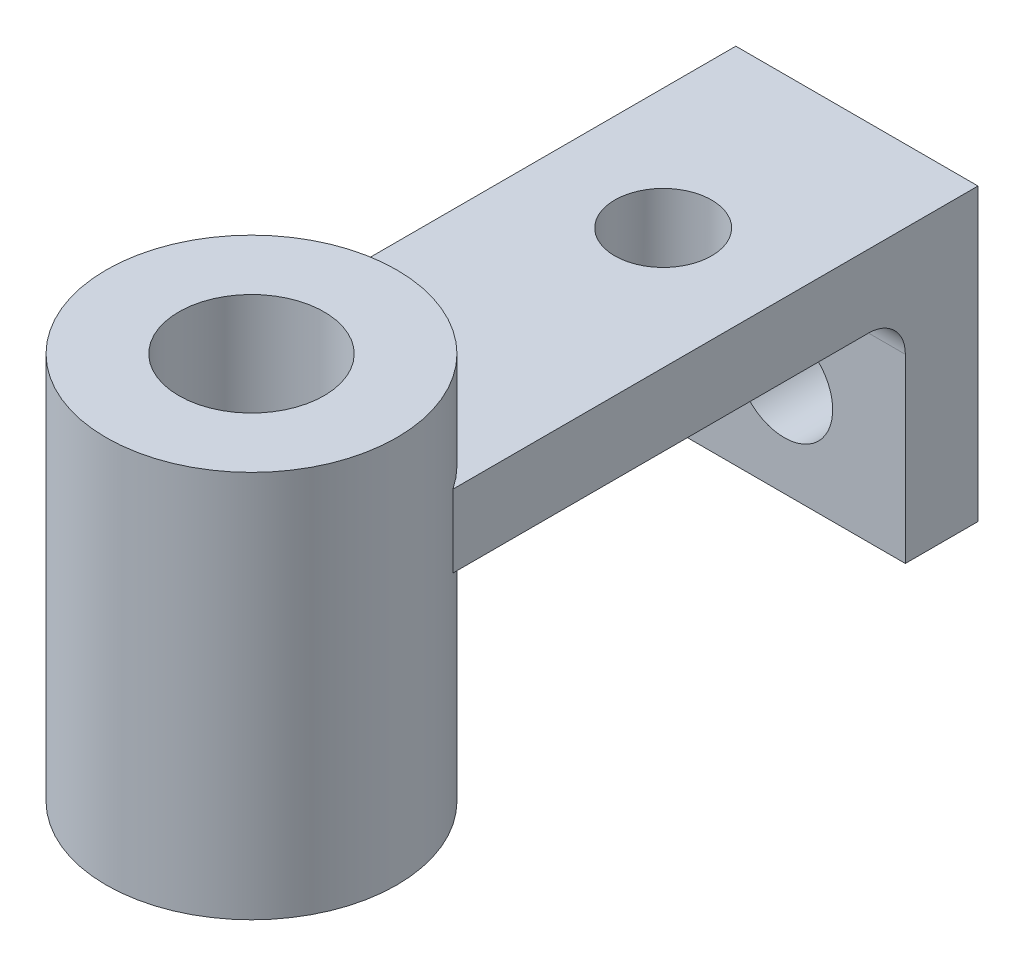
ISO-10303-21;
HEADER;
FILE_DESCRIPTION(('STEP AP214'),'2;1');
FILE_NAME('part.step','',(''),(''),'','','');
FILE_SCHEMA(('AUTOMOTIVE_DESIGN { 1 0 10303 214 1 1 1 1 }'));
ENDSEC;
DATA;
#1=APPLICATION_CONTEXT('core data for automotive mechanical design processes');
#2=APPLICATION_PROTOCOL_DEFINITION('international standard','automotive_design',2000,#1);
#3=PRODUCT_CONTEXT('',#1,'mechanical');
#4=PRODUCT('Part','Part','',(#3));
#5=PRODUCT_RELATED_PRODUCT_CATEGORY('part','',(#4));
#6=PRODUCT_DEFINITION_FORMATION('','',#4);
#7=PRODUCT_DEFINITION_CONTEXT('part definition',#1,'design');
#8=PRODUCT_DEFINITION('design','',#6,#7);
#9=PRODUCT_DEFINITION_SHAPE('','',#8);
#10=(LENGTH_UNIT() NAMED_UNIT(*) SI_UNIT(.MILLI.,.METRE.));
#11=(NAMED_UNIT(*) PLANE_ANGLE_UNIT() SI_UNIT($,.RADIAN.));
#12=(NAMED_UNIT(*) SI_UNIT($,.STERADIAN.) SOLID_ANGLE_UNIT());
#13=UNCERTAINTY_MEASURE_WITH_UNIT(LENGTH_MEASURE(1.E-05),#10,'distance_accuracy_value','');
#14=(GEOMETRIC_REPRESENTATION_CONTEXT(3) GLOBAL_UNCERTAINTY_ASSIGNED_CONTEXT((#13)) GLOBAL_UNIT_ASSIGNED_CONTEXT((#10,
#11,#12)) REPRESENTATION_CONTEXT('',''));
#15=CARTESIAN_POINT('',(0.,0.,0.));
#16=DIRECTION('',(0.,0.,1.));
#17=DIRECTION('',(1.,0.,0.));
#18=AXIS2_PLACEMENT_3D('',#15,#16,#17);
#19=CARTESIAN_POINT('',(31.75,-9.58849999999999,-25.3365));
#20=DIRECTION('',(-1.,0.,0.));
#21=DIRECTION('',(0.,0.,1.));
#22=AXIS2_PLACEMENT_3D('',#19,#20,#21);
#23=CYLINDRICAL_SURFACE('',#22,4.826);
#24=CARTESIAN_POINT('',(0.,-9.58849999999999,-25.3365));
#25=DIRECTION('',(1.,0.,0.));
#26=DIRECTION('',(0.,0.,-1.));
#27=AXIS2_PLACEMENT_3D('',#24,#25,#26);
#28=CIRCLE('',#27,4.826);
#29=CARTESIAN_POINT('',(0.,-9.58850000000002,-30.1625));
#30=VERTEX_POINT('',#29);
#31=CARTESIAN_POINT('',(0.,-4.76249999999999,-25.3365));
#32=VERTEX_POINT('',#31);
#33=EDGE_CURVE('E138',#30,#32,#28,.T.);
#34=ORIENTED_EDGE('',*,*,#33,.F.);
#35=DIRECTION('',(-1.,0.,0.));
#36=VECTOR('',#35,1.);
#37=CARTESIAN_POINT('',(31.75,-9.58850000000002,-30.1625));
#38=LINE('',#37,#36);
#39=CARTESIAN_POINT('',(31.75,-9.58850000000002,-30.1625));
#40=VERTEX_POINT('',#39);
#41=EDGE_CURVE('E47',#40,#30,#38,.T.);
#42=ORIENTED_EDGE('',*,*,#41,.F.);
#43=CARTESIAN_POINT('',(31.75,-9.58849999999999,-25.3365));
#44=DIRECTION('',(1.,0.,0.));
#45=DIRECTION('',(0.,0.,-1.));
#46=AXIS2_PLACEMENT_3D('',#43,#44,#45);
#47=CIRCLE('',#46,4.826);
#48=CARTESIAN_POINT('',(31.75,-4.76249999999999,-25.3365));
#49=VERTEX_POINT('',#48);
#50=EDGE_CURVE('E159',#40,#49,#47,.T.);
#51=ORIENTED_EDGE('',*,*,#50,.T.);
#52=DIRECTION('',(-1.,0.,0.));
#53=VECTOR('',#52,1.);
#54=CARTESIAN_POINT('',(31.75,-4.76249999999999,-25.3365));
#55=LINE('',#54,#53);
#56=EDGE_CURVE('E91',#49,#32,#55,.T.);
#57=ORIENTED_EDGE('',*,*,#56,.T.);
#58=EDGE_LOOP('',(#34,#42,#51,#57));
#59=FACE_BOUND('',#58,.T.);
#60=ADVANCED_FACE('F39',(#59),#23,.F.);
#61=CARTESIAN_POINT('',(31.75,-33.3375,-30.1625));
#62=DIRECTION('',(0.,0.,1.));
#63=DIRECTION('',(1.,0.,0.));
#64=AXIS2_PLACEMENT_3D('',#61,#62,#63);
#65=PLANE('',#64);
#66=CARTESIAN_POINT('',(15.875,-20.6375,-30.1625));
#67=DIRECTION('',(0.,0.,1.));
#68=DIRECTION('',(1.,0.,0.));
#69=AXIS2_PLACEMENT_3D('',#66,#67,#68);
#70=CIRCLE('',#69,6.35);
#71=CARTESIAN_POINT('',(9.525,-20.6375,-30.1625));
#72=VERTEX_POINT('',#71);
#73=EDGE_CURVE('E257',#72,#72,#70,.F.);
#74=ORIENTED_EDGE('',*,*,#73,.T.);
#75=EDGE_LOOP('',(#74));
#76=FACE_BOUND('',#75,.T.);
#77=DIRECTION('',(0.,1.,0.));
#78=VECTOR('',#77,1.);
#79=CARTESIAN_POINT('',(0.,-33.3375,-30.1625));
#80=LINE('',#79,#78);
#81=CARTESIAN_POINT('',(0.,-33.3375,-30.1625));
#82=VERTEX_POINT('',#81);
#83=EDGE_CURVE('E155',#82,#30,#80,.T.);
#84=ORIENTED_EDGE('',*,*,#83,.F.);
#85=DIRECTION('',(-1.,0.,0.));
#86=VECTOR('',#85,1.);
#87=CARTESIAN_POINT('',(31.75,-33.3375,-30.1625));
#88=LINE('',#87,#86);
#89=CARTESIAN_POINT('',(31.75,-33.3375,-30.1625));
#90=VERTEX_POINT('',#89);
#91=EDGE_CURVE('E113',#90,#82,#88,.T.);
#92=ORIENTED_EDGE('',*,*,#91,.F.);
#93=DIRECTION('',(0.,1.,0.));
#94=VECTOR('',#93,1.);
#95=CARTESIAN_POINT('',(31.75,-33.3375,-30.1625));
#96=LINE('',#95,#94);
#97=EDGE_CURVE('E122',#90,#40,#96,.T.);
#98=ORIENTED_EDGE('',*,*,#97,.T.);
#99=ORIENTED_EDGE('',*,*,#41,.T.);
#100=EDGE_LOOP('',(#84,#92,#98,#99));
#101=FACE_BOUND('',#100,.T.);
#102=ADVANCED_FACE('F174',(#76,#101),#65,.T.);
#103=CARTESIAN_POINT('',(31.75,-33.3375,-39.6875));
#104=DIRECTION('',(0.,-1.,0.));
#105=DIRECTION('',(0.,0.,-1.));
#106=AXIS2_PLACEMENT_3D('',#103,#104,#105);
#107=PLANE('',#106);
#108=DIRECTION('',(0.,0.,1.));
#109=VECTOR('',#108,1.);
#110=CARTESIAN_POINT('',(0.,-33.3375,-39.6875));
#111=LINE('',#110,#109);
#112=CARTESIAN_POINT('',(0.,-33.3375,-39.6875));
#113=VERTEX_POINT('',#112);
#114=EDGE_CURVE('E107',#113,#82,#111,.T.);
#115=ORIENTED_EDGE('',*,*,#114,.F.);
#116=DIRECTION('',(-1.,0.,0.));
#117=VECTOR('',#116,1.);
#118=CARTESIAN_POINT('',(31.75,-33.3375,-39.6875));
#119=LINE('',#118,#117);
#120=CARTESIAN_POINT('',(31.75,-33.3375,-39.6875));
#121=VERTEX_POINT('',#120);
#122=EDGE_CURVE('E101',#121,#113,#119,.T.);
#123=ORIENTED_EDGE('',*,*,#122,.F.);
#124=DIRECTION('',(0.,0.,1.));
#125=VECTOR('',#124,1.);
#126=CARTESIAN_POINT('',(31.75,-33.3375,-39.6875));
#127=LINE('',#126,#125);
#128=EDGE_CURVE('E104',#121,#90,#127,.T.);
#129=ORIENTED_EDGE('',*,*,#128,.T.);
#130=ORIENTED_EDGE('',*,*,#91,.T.);
#131=EDGE_LOOP('',(#115,#123,#129,#130));
#132=FACE_BOUND('',#131,.T.);
#133=ADVANCED_FACE('F103',(#132),#107,.T.);
#134=CARTESIAN_POINT('',(31.75,4.7625,-39.6875));
#135=DIRECTION('',(0.,0.,-1.));
#136=DIRECTION('',(-1.,0.,0.));
#137=AXIS2_PLACEMENT_3D('',#134,#135,#136);
#138=PLANE('',#137);
#139=CARTESIAN_POINT('',(15.875,-20.6375,-39.6875));
#140=DIRECTION('',(0.,0.,-1.));
#141=DIRECTION('',(-1.,0.,0.));
#142=AXIS2_PLACEMENT_3D('',#139,#140,#141);
#143=CIRCLE('',#142,6.35);
#144=CARTESIAN_POINT('',(9.525,-20.6375,-39.6875));
#145=VERTEX_POINT('',#144);
#146=EDGE_CURVE('E143',#145,#145,#143,.T.);
#147=ORIENTED_EDGE('',*,*,#146,.F.);
#148=EDGE_LOOP('',(#147));
#149=FACE_BOUND('',#148,.T.);
#150=DIRECTION('',(0.,-1.,0.));
#151=VECTOR('',#150,1.);
#152=CARTESIAN_POINT('',(0.,4.7625,-39.6875));
#153=LINE('',#152,#151);
#154=CARTESIAN_POINT('',(0.,4.7625,-39.6875));
#155=VERTEX_POINT('',#154);
#156=EDGE_CURVE('E150',#155,#113,#153,.T.);
#157=ORIENTED_EDGE('',*,*,#156,.F.);
#158=DIRECTION('',(-1.,0.,0.));
#159=VECTOR('',#158,1.);
#160=CARTESIAN_POINT('',(31.75,4.7625,-39.6875));
#161=LINE('',#160,#159);
#162=CARTESIAN_POINT('',(31.75,4.7625,-39.6875));
#163=VERTEX_POINT('',#162);
#164=EDGE_CURVE('E114',#163,#155,#161,.T.);
#165=ORIENTED_EDGE('',*,*,#164,.F.);
#166=DIRECTION('',(0.,-1.,0.));
#167=VECTOR('',#166,1.);
#168=CARTESIAN_POINT('',(31.75,4.7625,-39.6875));
#169=LINE('',#168,#167);
#170=EDGE_CURVE('E121',#163,#121,#169,.T.);
#171=ORIENTED_EDGE('',*,*,#170,.T.);
#172=ORIENTED_EDGE('',*,*,#122,.T.);
#173=EDGE_LOOP('',(#157,#165,#171,#172));
#174=FACE_BOUND('',#173,.T.);
#175=ADVANCED_FACE('F126',(#149,#174),#138,.T.);
#176=CARTESIAN_POINT('',(31.75,4.7625,39.6875));
#177=DIRECTION('',(0.,1.,0.));
#178=DIRECTION('',(0.,0.,1.));
#179=AXIS2_PLACEMENT_3D('',#176,#177,#178);
#180=PLANE('',#179);
#181=CARTESIAN_POINT('',(15.875,4.7625,39.6875));
#182=DIRECTION('',(0.,1.,0.));
#183=DIRECTION('',(0.,0.,1.));
#184=AXIS2_PLACEMENT_3D('',#181,#182,#183);
#185=CIRCLE('',#184,19.05);
#186=CARTESIAN_POINT('',(31.75,4.7625,29.1572162906216));
#187=VERTEX_POINT('',#186);
#188=CARTESIAN_POINT('',(0.,4.7625,29.1572162906216));
#189=VERTEX_POINT('',#188);
#190=EDGE_CURVE('E54',#187,#189,#185,.T.);
#191=ORIENTED_EDGE('',*,*,#190,.F.);
#192=DIRECTION('',(0.,0.,-1.));
#193=VECTOR('',#192,1.);
#194=CARTESIAN_POINT('',(31.75,4.7625,39.6875));
#195=LINE('',#194,#193);
#196=EDGE_CURVE('E129',#187,#163,#195,.T.);
#197=ORIENTED_EDGE('',*,*,#196,.T.);
#198=ORIENTED_EDGE('',*,*,#164,.T.);
#199=DIRECTION('',(0.,0.,-1.));
#200=VECTOR('',#199,1.);
#201=CARTESIAN_POINT('',(0.,4.7625,39.6875));
#202=LINE('',#201,#200);
#203=EDGE_CURVE('E147',#189,#155,#202,.T.);
#204=ORIENTED_EDGE('',*,*,#203,.F.);
#205=EDGE_LOOP('',(#191,#197,#198,#204));
#206=FACE_BOUND('',#205,.T.);
#207=CARTESIAN_POINT('',(15.875,4.7625,-14.2875));
#208=DIRECTION('',(0.,1.,0.));
#209=DIRECTION('',(0.,0.,1.));
#210=AXIS2_PLACEMENT_3D('',#207,#208,#209);
#211=CIRCLE('',#210,6.35);
#212=CARTESIAN_POINT('',(15.875,4.7625,-7.9375));
#213=VERTEX_POINT('',#212);
#214=EDGE_CURVE('E253',#213,#213,#211,.T.);
#215=ORIENTED_EDGE('',*,*,#214,.F.);
#216=EDGE_LOOP('',(#215));
#217=FACE_BOUND('',#216,.T.);
#218=ADVANCED_FACE('F189',(#206,#217),#180,.T.);
#219=CARTESIAN_POINT('',(31.75,-4.76249999999999,-25.3365));
#220=DIRECTION('',(0.,-1.,0.));
#221=DIRECTION('',(0.,0.,-1.));
#222=AXIS2_PLACEMENT_3D('',#219,#220,#221);
#223=PLANE('',#222);
#224=CARTESIAN_POINT('',(15.875,-4.7625,39.6875));
#225=DIRECTION('',(0.,-1.,0.));
#226=DIRECTION('',(0.,0.,-1.));
#227=AXIS2_PLACEMENT_3D('',#224,#225,#226);
#228=CIRCLE('',#227,19.05);
#229=CARTESIAN_POINT('',(0.,-4.7625,29.1572162906216));
#230=VERTEX_POINT('',#229);
#231=CARTESIAN_POINT('',(31.75,-4.7625,29.1572162906216));
#232=VERTEX_POINT('',#231);
#233=EDGE_CURVE('E171',#230,#232,#228,.T.);
#234=ORIENTED_EDGE('',*,*,#233,.F.);
#235=DIRECTION('',(0.,0.,1.));
#236=VECTOR('',#235,1.);
#237=CARTESIAN_POINT('',(0.,-4.76249999999999,-25.3365));
#238=LINE('',#237,#236);
#239=EDGE_CURVE('E142',#32,#230,#238,.T.);
#240=ORIENTED_EDGE('',*,*,#239,.F.);
#241=ORIENTED_EDGE('',*,*,#56,.F.);
#242=DIRECTION('',(0.,0.,1.));
#243=VECTOR('',#242,1.);
#244=CARTESIAN_POINT('',(31.75,-4.76249999999999,-25.3365));
#245=LINE('',#244,#243);
#246=EDGE_CURVE('E132',#49,#232,#245,.T.);
#247=ORIENTED_EDGE('',*,*,#246,.T.);
#248=EDGE_LOOP('',(#234,#240,#241,#247));
#249=FACE_BOUND('',#248,.T.);
#250=CARTESIAN_POINT('',(15.875,-4.76249999999999,-14.2875));
#251=DIRECTION('',(0.,-1.,0.));
#252=DIRECTION('',(0.,0.,-1.));
#253=AXIS2_PLACEMENT_3D('',#250,#251,#252);
#254=CIRCLE('',#253,6.35);
#255=CARTESIAN_POINT('',(15.875,-4.76249999999999,-20.6375));
#256=VERTEX_POINT('',#255);
#257=EDGE_CURVE('E252',#256,#256,#254,.F.);
#258=ORIENTED_EDGE('',*,*,#257,.T.);
#259=EDGE_LOOP('',(#258));
#260=FACE_BOUND('',#259,.T.);
#261=ADVANCED_FACE('F167',(#249,#260),#223,.T.);
#262=CARTESIAN_POINT('',(31.75,-9.58849999999999,-25.3365));
#263=DIRECTION('',(1.,0.,0.));
#264=DIRECTION('',(0.,0.,-1.));
#265=AXIS2_PLACEMENT_3D('',#262,#263,#264);
#266=PLANE('',#265);
#267=DIRECTION('',(0.,1.,0.));
#268=VECTOR('',#267,1.);
#269=CARTESIAN_POINT('',(31.75,-33.3375,29.1572162906216));
#270=LINE('',#269,#268);
#271=EDGE_CURVE('E249',#232,#187,#270,.T.);
#272=ORIENTED_EDGE('',*,*,#271,.F.);
#273=ORIENTED_EDGE('',*,*,#246,.F.);
#274=ORIENTED_EDGE('',*,*,#50,.F.);
#275=ORIENTED_EDGE('',*,*,#97,.F.);
#276=ORIENTED_EDGE('',*,*,#128,.F.);
#277=ORIENTED_EDGE('',*,*,#170,.F.);
#278=ORIENTED_EDGE('',*,*,#196,.F.);
#279=EDGE_LOOP('',(#272,#273,#274,#275,#276,#277,#278));
#280=FACE_BOUND('',#279,.T.);
#281=ADVANCED_FACE('F119',(#280),#266,.T.);
#282=CARTESIAN_POINT('',(0.,-9.58849999999999,-25.3365));
#283=DIRECTION('',(1.,0.,0.));
#284=DIRECTION('',(0.,0.,-1.));
#285=AXIS2_PLACEMENT_3D('',#282,#283,#284);
#286=PLANE('',#285);
#287=ORIENTED_EDGE('',*,*,#239,.T.);
#288=DIRECTION('',(0.,1.,0.));
#289=VECTOR('',#288,1.);
#290=CARTESIAN_POINT('',(0.,-33.3375,29.1572162906216));
#291=LINE('',#290,#289);
#292=EDGE_CURVE('E11',#230,#189,#291,.T.);
#293=ORIENTED_EDGE('',*,*,#292,.T.);
#294=ORIENTED_EDGE('',*,*,#203,.T.);
#295=ORIENTED_EDGE('',*,*,#156,.T.);
#296=ORIENTED_EDGE('',*,*,#114,.T.);
#297=ORIENTED_EDGE('',*,*,#83,.T.);
#298=ORIENTED_EDGE('',*,*,#33,.T.);
#299=EDGE_LOOP('',(#287,#293,#294,#295,#296,#297,#298));
#300=FACE_BOUND('',#299,.T.);
#301=ADVANCED_FACE('F173',(#300),#286,.F.);
#302=CARTESIAN_POINT('',(15.875,-20.6375,39.6885));
#303=DIRECTION('',(0.,0.,-1.));
#304=DIRECTION('',(-1.,0.,0.));
#305=AXIS2_PLACEMENT_3D('',#302,#303,#304);
#306=CYLINDRICAL_SURFACE('',#305,6.35);
#307=CARTESIAN_POINT('',(9.525,-20.6375,-30.1625));
#308=CARTESIAN_POINT('',(9.525,-20.6375,-30.26171875));
#309=CARTESIAN_POINT('',(9.525,-20.6375,-30.3609375));
#310=CARTESIAN_POINT('',(9.525,-20.6375,-30.559375));
#311=CARTESIAN_POINT('',(9.525,-20.6375,-30.65859375));
#312=CARTESIAN_POINT('',(9.525,-20.6375,-30.85703125));
#313=CARTESIAN_POINT('',(9.525,-20.6375,-30.95625));
#314=CARTESIAN_POINT('',(9.525,-20.6375,-31.1546875));
#315=CARTESIAN_POINT('',(9.525,-20.6375,-31.25390625));
#316=CARTESIAN_POINT('',(9.525,-20.6375,-31.45234375));
#317=CARTESIAN_POINT('',(9.525,-20.6375,-31.5515625));
#318=CARTESIAN_POINT('',(9.525,-20.6375,-31.75));
#319=CARTESIAN_POINT('',(9.525,-20.6375,-31.84921875));
#320=CARTESIAN_POINT('',(9.525,-20.6375,-32.04765625));
#321=CARTESIAN_POINT('',(9.525,-20.6375,-32.146875));
#322=CARTESIAN_POINT('',(9.525,-20.6375,-32.3453125));
#323=CARTESIAN_POINT('',(9.525,-20.6375,-32.44453125));
#324=CARTESIAN_POINT('',(9.525,-20.6375,-32.64296875));
#325=CARTESIAN_POINT('',(9.525,-20.6375,-32.7421875));
#326=CARTESIAN_POINT('',(9.525,-20.6375,-32.940625));
#327=CARTESIAN_POINT('',(9.525,-20.6375,-33.03984375));
#328=CARTESIAN_POINT('',(9.525,-20.6375,-33.23828125));
#329=CARTESIAN_POINT('',(9.525,-20.6375,-33.3375));
#330=CARTESIAN_POINT('',(9.525,-20.6375,-33.5359375));
#331=CARTESIAN_POINT('',(9.525,-20.6375,-33.63515625));
#332=CARTESIAN_POINT('',(9.525,-20.6375,-33.83359375));
#333=CARTESIAN_POINT('',(9.525,-20.6375,-33.9328125));
#334=CARTESIAN_POINT('',(9.525,-20.6375,-34.13125));
#335=CARTESIAN_POINT('',(9.525,-20.6375,-34.23046875));
#336=CARTESIAN_POINT('',(9.525,-20.6375,-34.42890625));
#337=CARTESIAN_POINT('',(9.525,-20.6375,-34.528125));
#338=CARTESIAN_POINT('',(9.525,-20.6375,-34.7265625));
#339=CARTESIAN_POINT('',(9.525,-20.6375,-34.82578125));
#340=CARTESIAN_POINT('',(9.525,-20.6375,-35.02421875));
#341=CARTESIAN_POINT('',(9.525,-20.6375,-35.1234375));
#342=CARTESIAN_POINT('',(9.525,-20.6375,-35.321875));
#343=CARTESIAN_POINT('',(9.525,-20.6375,-35.42109375));
#344=CARTESIAN_POINT('',(9.525,-20.6375,-35.61953125));
#345=CARTESIAN_POINT('',(9.525,-20.6375,-35.71875));
#346=CARTESIAN_POINT('',(9.525,-20.6375,-35.9171875));
#347=CARTESIAN_POINT('',(9.525,-20.6375,-36.01640625));
#348=CARTESIAN_POINT('',(9.525,-20.6375,-36.21484375));
#349=CARTESIAN_POINT('',(9.525,-20.6375,-36.3140625));
#350=CARTESIAN_POINT('',(9.525,-20.6375,-36.5125));
#351=CARTESIAN_POINT('',(9.525,-20.6375,-36.61171875));
#352=CARTESIAN_POINT('',(9.525,-20.6375,-36.81015625));
#353=CARTESIAN_POINT('',(9.525,-20.6375,-36.909375));
#354=CARTESIAN_POINT('',(9.525,-20.6375,-37.1078125));
#355=CARTESIAN_POINT('',(9.525,-20.6375,-37.20703125));
#356=CARTESIAN_POINT('',(9.525,-20.6375,-37.40546875));
#357=CARTESIAN_POINT('',(9.525,-20.6375,-37.5046875));
#358=CARTESIAN_POINT('',(9.525,-20.6375,-37.703125));
#359=CARTESIAN_POINT('',(9.525,-20.6375,-37.80234375));
#360=CARTESIAN_POINT('',(9.525,-20.6375,-38.00078125));
#361=CARTESIAN_POINT('',(9.525,-20.6375,-38.1));
#362=CARTESIAN_POINT('',(9.525,-20.6375,-38.2984375));
#363=CARTESIAN_POINT('',(9.525,-20.6375,-38.39765625));
#364=CARTESIAN_POINT('',(9.525,-20.6375,-38.59609375));
#365=CARTESIAN_POINT('',(9.525,-20.6375,-38.6953125));
#366=CARTESIAN_POINT('',(9.525,-20.6375,-38.89375));
#367=CARTESIAN_POINT('',(9.525,-20.6375,-38.99296875));
#368=CARTESIAN_POINT('',(9.525,-20.6375,-39.19140625));
#369=CARTESIAN_POINT('',(9.525,-20.6375,-39.290625));
#370=CARTESIAN_POINT('',(9.525,-20.6375,-39.4890625));
#371=CARTESIAN_POINT('',(9.525,-20.6375,-39.58828125));
#372=CARTESIAN_POINT('',(9.525,-20.6375,-39.6875));
#373=B_SPLINE_CURVE_WITH_KNOTS('',3,(#307,#308,#309,#310,#311,#312,#313,#314,#315,#316,#317,
#318,#319,#320,#321,#322,#323,#324,#325,#326,#327,#328,#329,#330,#331,#332,#333,#334,#335,#336,
#337,#338,#339,#340,#341,#342,#343,#344,#345,#346,#347,#348,#349,#350,#351,#352,#353,#354,#355,
#356,#357,#358,#359,#360,#361,#362,#363,#364,#365,#366,#367,#368,#369,#370,#371,#372),
.UNSPECIFIED.,.F.,.F.,(4,2,2,2,2,2,2,2,2,2,2,2,2,2,2,2,2,2,2,2,2,2,2,2,2,2,2,2,2,2,2,2,4),(0.,
0.29765625,0.5953125,0.892968750000001,1.190625,1.48828125,1.7859375,2.08359375,2.38125,
2.67890624999999,2.97656249999999,3.27421874999999,3.57187499999999,3.86953124999999,
4.16718749999999,4.46484374999999,4.76249999999999,5.06015624999999,5.35781249999999,
5.65546874999999,5.95312499999999,6.25078124999999,6.54843749999999,6.84609374999999,
7.14374999999998,7.44140624999998,7.73906249999998,8.03671874999998,8.33437499999998,
8.63203124999998,8.92968749999998,9.22734374999998,9.52499999999998),.UNSPECIFIED.);
#374=EDGE_CURVE('BSEAM200',#72,#145,#373,.T.);
#375=ORIENTED_EDGE('',*,*,#73,.F.);
#376=ORIENTED_EDGE('',*,*,#146,.T.);
#377=ORIENTED_EDGE('',*,*,#374,.T.);
#378=ORIENTED_EDGE('',*,*,#374,.F.);
#379=EDGE_LOOP('',(#375,#377,#376,#378));
#380=FACE_BOUND('',#379,.T.);
#381=ADVANCED_FACE('F200',(#380),#306,.F.);
#382=CARTESIAN_POINT('',(15.875,-33.3385,-14.2875));
#383=DIRECTION('',(0.,1.,0.));
#384=DIRECTION('',(0.,0.,1.));
#385=AXIS2_PLACEMENT_3D('',#382,#383,#384);
#386=CYLINDRICAL_SURFACE('',#385,6.35);
#387=ORIENTED_EDGE('',*,*,#257,.F.);
#388=EDGE_LOOP('',(#387));
#389=FACE_BOUND('',#388,.T.);
#390=ORIENTED_EDGE('',*,*,#214,.T.);
#391=EDGE_LOOP('',(#390));
#392=FACE_BOUND('',#391,.T.);
#393=ADVANCED_FACE('F204',(#389,#392),#386,.F.);
#394=CARTESIAN_POINT('',(15.875,-33.3375,39.6875));
#395=DIRECTION('',(0.,1.,0.));
#396=DIRECTION('',(0.,0.,1.));
#397=AXIS2_PLACEMENT_3D('',#394,#395,#396);
#398=CYLINDRICAL_SURFACE('',#397,19.05);
#399=ORIENTED_EDGE('',*,*,#233,.T.);
#400=ORIENTED_EDGE('',*,*,#271,.T.);
#401=ORIENTED_EDGE('',*,*,#190,.T.);
#402=ORIENTED_EDGE('',*,*,#292,.F.);
#403=EDGE_LOOP('',(#399,#400,#401,#402));
#404=FACE_BOUND('',#403,.T.);
#405=CARTESIAN_POINT('',(15.875,-33.3375,39.6875));
#406=DIRECTION('',(0.,1.,0.));
#407=DIRECTION('',(0.,0.,1.));
#408=AXIS2_PLACEMENT_3D('',#405,#406,#407);
#409=CIRCLE('',#408,19.05);
#410=CARTESIAN_POINT('',(15.875,-33.3375,58.7375));
#411=VERTEX_POINT('',#410);
#412=EDGE_CURVE('E241',#411,#411,#409,.T.);
#413=ORIENTED_EDGE('',*,*,#412,.T.);
#414=EDGE_LOOP('',(#413));
#415=FACE_BOUND('',#414,.T.);
#416=CARTESIAN_POINT('',(15.875,17.4625,39.6875));
#417=DIRECTION('',(0.,1.,0.));
#418=DIRECTION('',(0.,0.,1.));
#419=AXIS2_PLACEMENT_3D('',#416,#417,#418);
#420=CIRCLE('',#419,19.05);
#421=CARTESIAN_POINT('',(15.875,17.4625,58.7375));
#422=VERTEX_POINT('',#421);
#423=EDGE_CURVE('E235',#422,#422,#420,.T.);
#424=ORIENTED_EDGE('',*,*,#423,.F.);
#425=EDGE_LOOP('',(#424));
#426=FACE_BOUND('',#425,.T.);
#427=ADVANCED_FACE('F208',(#404,#415,#426),#398,.T.);
#428=CARTESIAN_POINT('',(15.875,-33.3375,39.6875));
#429=DIRECTION('',(0.,1.,0.));
#430=DIRECTION('',(0.,0.,1.));
#431=AXIS2_PLACEMENT_3D('',#428,#429,#430);
#432=PLANE('',#431);
#433=CARTESIAN_POINT('',(15.875,-33.3375,39.6875));
#434=DIRECTION('',(0.,1.,0.));
#435=DIRECTION('',(0.,0.,1.));
#436=AXIS2_PLACEMENT_3D('',#433,#434,#435);
#437=CIRCLE('',#436,9.525);
#438=CARTESIAN_POINT('',(15.875,-33.3375,49.2125));
#439=VERTEX_POINT('',#438);
#440=EDGE_CURVE('E228',#439,#439,#437,.T.);
#441=ORIENTED_EDGE('',*,*,#440,.T.);
#442=EDGE_LOOP('',(#441));
#443=FACE_BOUND('',#442,.T.);
#444=ORIENTED_EDGE('',*,*,#412,.F.);
#445=EDGE_LOOP('',(#444));
#446=FACE_BOUND('',#445,.T.);
#447=ADVANCED_FACE('F212',(#443,#446),#432,.F.);
#448=CARTESIAN_POINT('',(15.875,17.4625,39.6875));
#449=DIRECTION('',(0.,1.,0.));
#450=DIRECTION('',(0.,0.,1.));
#451=AXIS2_PLACEMENT_3D('',#448,#449,#450);
#452=PLANE('',#451);
#453=CARTESIAN_POINT('',(15.875,17.4625,39.6875));
#454=DIRECTION('',(0.,1.,0.));
#455=DIRECTION('',(0.,0.,1.));
#456=AXIS2_PLACEMENT_3D('',#453,#454,#455);
#457=CIRCLE('',#456,9.525);
#458=CARTESIAN_POINT('',(15.875,17.4625,49.2125));
#459=VERTEX_POINT('',#458);
#460=EDGE_CURVE('E231',#459,#459,#457,.T.);
#461=ORIENTED_EDGE('',*,*,#460,.F.);
#462=EDGE_LOOP('',(#461));
#463=FACE_BOUND('',#462,.T.);
#464=ORIENTED_EDGE('',*,*,#423,.T.);
#465=EDGE_LOOP('',(#464));
#466=FACE_BOUND('',#465,.T.);
#467=ADVANCED_FACE('F215',(#463,#466),#452,.T.);
#468=CARTESIAN_POINT('',(15.875,-33.3375,39.6875));
#469=DIRECTION('',(0.,1.,0.));
#470=DIRECTION('',(0.,0.,1.));
#471=AXIS2_PLACEMENT_3D('',#468,#469,#470);
#472=CYLINDRICAL_SURFACE('',#471,9.525);
#473=CARTESIAN_POINT('',(15.875,-33.3375,49.2125));
#474=CARTESIAN_POINT('',(15.875,-32.8083333333333,49.2125));
#475=CARTESIAN_POINT('',(15.875,-32.2791666666667,49.2125));
#476=CARTESIAN_POINT('',(15.875,-31.2208333333333,49.2125));
#477=CARTESIAN_POINT('',(15.875,-30.6916666666667,49.2125));
#478=CARTESIAN_POINT('',(15.875,-29.6333333333333,49.2125));
#479=CARTESIAN_POINT('',(15.875,-29.1041666666667,49.2125));
#480=CARTESIAN_POINT('',(15.875,-28.0458333333333,49.2125));
#481=CARTESIAN_POINT('',(15.875,-27.5166666666667,49.2125));
#482=CARTESIAN_POINT('',(15.875,-26.4583333333333,49.2125));
#483=CARTESIAN_POINT('',(15.875,-25.9291666666667,49.2125));
#484=CARTESIAN_POINT('',(15.875,-24.8708333333333,49.2125));
#485=CARTESIAN_POINT('',(15.875,-24.3416666666667,49.2125));
#486=CARTESIAN_POINT('',(15.875,-23.2833333333333,49.2125));
#487=CARTESIAN_POINT('',(15.875,-22.7541666666667,49.2125));
#488=CARTESIAN_POINT('',(15.875,-21.6958333333333,49.2125));
#489=CARTESIAN_POINT('',(15.875,-21.1666666666667,49.2125));
#490=CARTESIAN_POINT('',(15.875,-20.1083333333333,49.2125));
#491=CARTESIAN_POINT('',(15.875,-19.5791666666667,49.2125));
#492=CARTESIAN_POINT('',(15.875,-18.5208333333333,49.2125));
#493=CARTESIAN_POINT('',(15.875,-17.9916666666667,49.2125));
#494=CARTESIAN_POINT('',(15.875,-16.9333333333333,49.2125));
#495=CARTESIAN_POINT('',(15.875,-16.4041666666667,49.2125));
#496=CARTESIAN_POINT('',(15.875,-15.3458333333333,49.2125));
#497=CARTESIAN_POINT('',(15.875,-14.8166666666667,49.2125));
#498=CARTESIAN_POINT('',(15.875,-13.7583333333333,49.2125));
#499=CARTESIAN_POINT('',(15.875,-13.2291666666667,49.2125));
#500=CARTESIAN_POINT('',(15.875,-12.1708333333333,49.2125));
#501=CARTESIAN_POINT('',(15.875,-11.6416666666667,49.2125));
#502=CARTESIAN_POINT('',(15.875,-10.5833333333333,49.2125));
#503=CARTESIAN_POINT('',(15.875,-10.0541666666667,49.2125));
#504=CARTESIAN_POINT('',(15.875,-8.99583333333334,49.2125));
#505=CARTESIAN_POINT('',(15.875,-8.46666666666667,49.2125));
#506=CARTESIAN_POINT('',(15.875,-7.40833333333334,49.2125));
#507=CARTESIAN_POINT('',(15.875,-6.87916666666667,49.2125));
#508=CARTESIAN_POINT('',(15.875,-5.82083333333333,49.2125));
#509=CARTESIAN_POINT('',(15.875,-5.29166666666667,49.2125));
#510=CARTESIAN_POINT('',(15.875,-4.23333333333334,49.2125));
#511=CARTESIAN_POINT('',(15.875,-3.70416666666667,49.2125));
#512=CARTESIAN_POINT('',(15.875,-2.64583333333334,49.2125));
#513=CARTESIAN_POINT('',(15.875,-2.11666666666667,49.2125));
#514=CARTESIAN_POINT('',(15.875,-1.05833333333334,49.2125));
#515=CARTESIAN_POINT('',(15.875,-0.529166666666673,49.2125));
#516=CARTESIAN_POINT('',(15.875,0.529166666666659,49.2125));
#517=CARTESIAN_POINT('',(15.875,1.05833333333333,49.2125));
#518=CARTESIAN_POINT('',(15.875,2.11666666666666,49.2125));
#519=CARTESIAN_POINT('',(15.875,2.64583333333332,49.2125));
#520=CARTESIAN_POINT('',(15.875,3.70416666666666,49.2125));
#521=CARTESIAN_POINT('',(15.875,4.23333333333333,49.2125));
#522=CARTESIAN_POINT('',(15.875,5.29166666666666,49.2125));
#523=CARTESIAN_POINT('',(15.875,5.82083333333333,49.2125));
#524=CARTESIAN_POINT('',(15.875,6.87916666666666,49.2125));
#525=CARTESIAN_POINT('',(15.875,7.40833333333333,49.2125));
#526=CARTESIAN_POINT('',(15.875,8.46666666666666,49.2125));
#527=CARTESIAN_POINT('',(15.875,8.99583333333333,49.2125));
#528=CARTESIAN_POINT('',(15.875,10.0541666666667,49.2125));
#529=CARTESIAN_POINT('',(15.875,10.5833333333333,49.2125));
#530=CARTESIAN_POINT('',(15.875,11.6416666666667,49.2125));
#531=CARTESIAN_POINT('',(15.875,12.1708333333333,49.2125));
#532=CARTESIAN_POINT('',(15.875,13.2291666666667,49.2125));
#533=CARTESIAN_POINT('',(15.875,13.7583333333333,49.2125));
#534=CARTESIAN_POINT('',(15.875,14.8166666666667,49.2125));
#535=CARTESIAN_POINT('',(15.875,15.3458333333333,49.2125));
#536=CARTESIAN_POINT('',(15.875,16.4041666666667,49.2125));
#537=CARTESIAN_POINT('',(15.875,16.9333333333333,49.2125));
#538=CARTESIAN_POINT('',(15.875,17.4625,49.2125));
#539=B_SPLINE_CURVE_WITH_KNOTS('',3,(#473,#474,#475,#476,#477,#478,#479,#480,#481,#482,#483,
#484,#485,#486,#487,#488,#489,#490,#491,#492,#493,#494,#495,#496,#497,#498,#499,#500,#501,#502,
#503,#504,#505,#506,#507,#508,#509,#510,#511,#512,#513,#514,#515,#516,#517,#518,#519,#520,#521,
#522,#523,#524,#525,#526,#527,#528,#529,#530,#531,#532,#533,#534,#535,#536,#537,#538),
.UNSPECIFIED.,.F.,.F.,(4,2,2,2,2,2,2,2,2,2,2,2,2,2,2,2,2,2,2,2,2,2,2,2,2,2,2,2,2,2,2,2,4),(0.,
1.58750000000001,3.175,4.7625,6.35,7.93750000000001,9.52500000000001,11.1125,12.7,14.2875,
15.875,17.4625,19.05,20.6375,22.225,23.8125,25.4,26.9875,28.575,30.1625,31.75,33.3375,34.925,
36.5125,38.1,39.6875,41.275,42.8625,44.45,46.0375,47.625,49.2125,50.8),.UNSPECIFIED.);
#540=EDGE_CURVE('BSEAM219',#439,#459,#539,.T.);
#541=ORIENTED_EDGE('',*,*,#440,.F.);
#542=ORIENTED_EDGE('',*,*,#460,.T.);
#543=ORIENTED_EDGE('',*,*,#540,.T.);
#544=ORIENTED_EDGE('',*,*,#540,.F.);
#545=EDGE_LOOP('',(#541,#543,#542,#544));
#546=FACE_BOUND('',#545,.T.);
#547=ADVANCED_FACE('F219',(#546),#472,.F.);
#548=CLOSED_SHELL('',(#60,#102,#133,#175,#218,#261,#281,#301,#381,#393,#427,#447,#467,#547));
#549=MANIFOLD_SOLID_BREP('B2',#548);
#550=ADVANCED_BREP_SHAPE_REPRESENTATION('',(#18,#549),#14);
#551=SHAPE_DEFINITION_REPRESENTATION(#9,#550);
ENDSEC;
END-ISO-10303-21;
